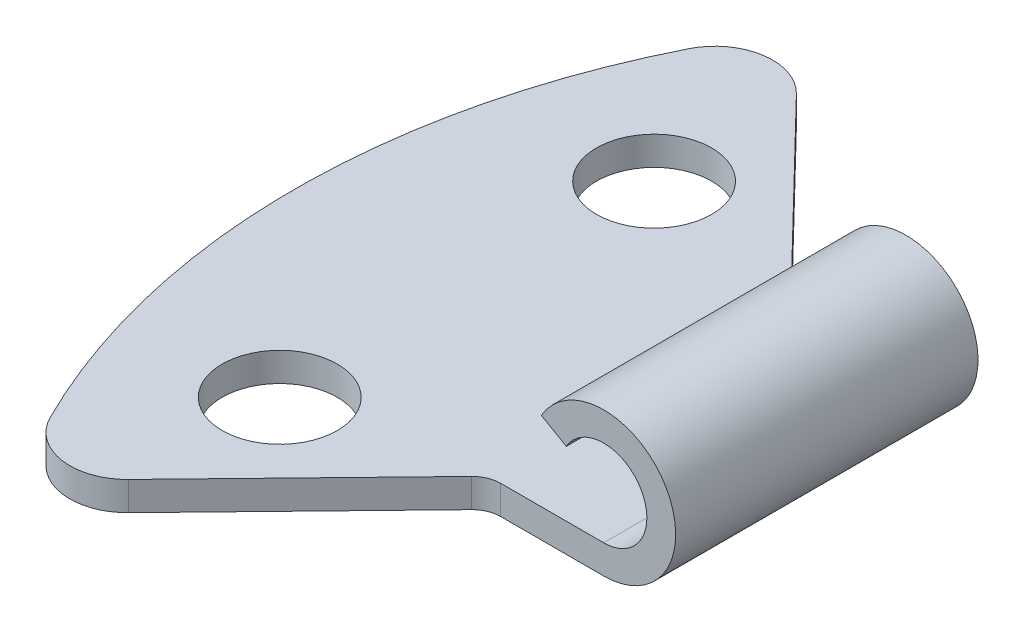
ISO-10303-21;
HEADER;
FILE_DESCRIPTION(('STEP AP214'),'2;1');
FILE_NAME('part.step','',(''),(''),'','','');
FILE_SCHEMA(('AUTOMOTIVE_DESIGN { 1 0 10303 214 1 1 1 1 }'));
ENDSEC;
DATA;
#1=APPLICATION_CONTEXT('core data for automotive mechanical design processes');
#2=APPLICATION_PROTOCOL_DEFINITION('international standard','automotive_design',2000,#1);
#3=PRODUCT_CONTEXT('',#1,'mechanical');
#4=PRODUCT('Part','Part','',(#3));
#5=PRODUCT_RELATED_PRODUCT_CATEGORY('part','',(#4));
#6=PRODUCT_DEFINITION_FORMATION('','',#4);
#7=PRODUCT_DEFINITION_CONTEXT('part definition',#1,'design');
#8=PRODUCT_DEFINITION('design','',#6,#7);
#9=PRODUCT_DEFINITION_SHAPE('','',#8);
#10=(LENGTH_UNIT() NAMED_UNIT(*) SI_UNIT(.MILLI.,.METRE.));
#11=(NAMED_UNIT(*) PLANE_ANGLE_UNIT() SI_UNIT($,.RADIAN.));
#12=(NAMED_UNIT(*) SI_UNIT($,.STERADIAN.) SOLID_ANGLE_UNIT());
#13=UNCERTAINTY_MEASURE_WITH_UNIT(LENGTH_MEASURE(1.E-05),#10,'distance_accuracy_value','');
#14=(GEOMETRIC_REPRESENTATION_CONTEXT(3) GLOBAL_UNCERTAINTY_ASSIGNED_CONTEXT((#13)) GLOBAL_UNIT_ASSIGNED_CONTEXT((#10,
#11,#12)) REPRESENTATION_CONTEXT('',''));
#15=CARTESIAN_POINT('',(0.,0.,0.));
#16=DIRECTION('',(0.,0.,1.));
#17=DIRECTION('',(1.,0.,0.));
#18=AXIS2_PLACEMENT_3D('',#15,#16,#17);
#19=CARTESIAN_POINT('',(8.,2.5,27.));
#20=DIRECTION('',(0.,0.,-1.));
#21=DIRECTION('',(-1.,0.,0.));
#22=AXIS2_PLACEMENT_3D('',#19,#20,#21);
#23=CYLINDRICAL_SURFACE('',#22,2.5);
#24=CARTESIAN_POINT('',(8.,2.5,8.25));
#25=DIRECTION('',(0.,0.,-1.));
#26=DIRECTION('',(-1.,0.,0.));
#27=AXIS2_PLACEMENT_3D('',#24,#25,#26);
#28=CIRCLE('',#27,2.5);
#29=CARTESIAN_POINT('',(5.83493649053891,3.75000000000001,8.25));
#30=VERTEX_POINT('',#29);
#31=CARTESIAN_POINT('',(8.,0.,8.25));
#32=VERTEX_POINT('',#31);
#33=EDGE_CURVE('E269',#30,#32,#28,.T.);
#34=ORIENTED_EDGE('',*,*,#33,.F.);
#35=DIRECTION('',(0.,0.,-1.));
#36=VECTOR('',#35,1.);
#37=CARTESIAN_POINT('',(5.83493649053891,3.75000000000001,27.));
#38=LINE('',#37,#36);
#39=CARTESIAN_POINT('',(5.83493649053891,3.75000000000001,18.75));
#40=VERTEX_POINT('',#39);
#41=EDGE_CURVE('E311',#40,#30,#38,.T.);
#42=ORIENTED_EDGE('',*,*,#41,.F.);
#43=CARTESIAN_POINT('',(8.,2.5,18.75));
#44=DIRECTION('',(0.,0.,1.));
#45=DIRECTION('',(1.,0.,0.));
#46=AXIS2_PLACEMENT_3D('',#43,#44,#45);
#47=CIRCLE('',#46,2.5);
#48=CARTESIAN_POINT('',(8.,0.,18.75));
#49=VERTEX_POINT('',#48);
#50=EDGE_CURVE('E294',#49,#40,#47,.T.);
#51=ORIENTED_EDGE('',*,*,#50,.F.);
#52=DIRECTION('',(0.,0.,-1.));
#53=VECTOR('',#52,1.);
#54=CARTESIAN_POINT('',(8.,0.,27.));
#55=LINE('',#54,#53);
#56=EDGE_CURVE('E314',#49,#32,#55,.T.);
#57=ORIENTED_EDGE('',*,*,#56,.T.);
#58=EDGE_LOOP('',(#34,#42,#51,#57));
#59=FACE_BOUND('',#58,.T.);
#60=ADVANCED_FACE('F146',(#59),#23,.T.);
#61=CARTESIAN_POINT('',(5.83493649053891,3.75000000000001,27.));
#62=DIRECTION('',(0.500000000000003,0.866025403784437,0.));
#63=DIRECTION('',(-0.866025403784437,0.500000000000003,0.));
#64=AXIS2_PLACEMENT_3D('',#61,#62,#63);
#65=PLANE('',#64);
#66=DIRECTION('',(-0.866025403784437,0.500000000000003,0.));
#67=VECTOR('',#66,1.);
#68=CARTESIAN_POINT('',(5.83493649053891,3.75000000000001,8.25));
#69=LINE('',#68,#67);
#70=CARTESIAN_POINT('',(6.70096189432335,3.25000000000001,8.25));
#71=VERTEX_POINT('',#70);
#72=EDGE_CURVE('E267',#71,#30,#69,.T.);
#73=ORIENTED_EDGE('',*,*,#72,.F.);
#74=DIRECTION('',(0.,0.,-1.));
#75=VECTOR('',#74,1.);
#76=CARTESIAN_POINT('',(6.70096189432335,3.25000000000001,27.));
#77=LINE('',#76,#75);
#78=CARTESIAN_POINT('',(6.70096189432335,3.25000000000001,18.75));
#79=VERTEX_POINT('',#78);
#80=EDGE_CURVE('E308',#79,#71,#77,.T.);
#81=ORIENTED_EDGE('',*,*,#80,.F.);
#82=DIRECTION('',(0.866025403784437,-0.500000000000003,0.));
#83=VECTOR('',#82,1.);
#84=CARTESIAN_POINT('',(5.83493649053891,3.75000000000001,18.75));
#85=LINE('',#84,#83);
#86=EDGE_CURVE('E292',#40,#79,#85,.T.);
#87=ORIENTED_EDGE('',*,*,#86,.F.);
#88=ORIENTED_EDGE('',*,*,#41,.T.);
#89=EDGE_LOOP('',(#73,#81,#87,#88));
#90=FACE_BOUND('',#89,.T.);
#91=ADVANCED_FACE('F348',(#90),#65,.F.);
#92=CARTESIAN_POINT('',(8.,2.5,27.));
#93=DIRECTION('',(0.,0.,-1.));
#94=DIRECTION('',(-1.,0.,0.));
#95=AXIS2_PLACEMENT_3D('',#92,#93,#94);
#96=CYLINDRICAL_SURFACE('',#95,1.5);
#97=CARTESIAN_POINT('',(8.,2.5,8.25));
#98=DIRECTION('',(0.,0.,-1.));
#99=DIRECTION('',(-1.,0.,0.));
#100=AXIS2_PLACEMENT_3D('',#97,#98,#99);
#101=CIRCLE('',#100,1.5);
#102=CARTESIAN_POINT('',(8.,1.,8.25));
#103=VERTEX_POINT('',#102);
#104=EDGE_CURVE('E247',#103,#71,#101,.F.);
#105=ORIENTED_EDGE('',*,*,#104,.F.);
#106=DIRECTION('',(0.,0.,-1.));
#107=VECTOR('',#106,1.);
#108=CARTESIAN_POINT('',(8.,1.,27.));
#109=LINE('',#108,#107);
#110=CARTESIAN_POINT('',(8.,1.,18.75));
#111=VERTEX_POINT('',#110);
#112=EDGE_CURVE('E305',#111,#103,#109,.T.);
#113=ORIENTED_EDGE('',*,*,#112,.F.);
#114=CARTESIAN_POINT('',(8.,2.5,18.75));
#115=DIRECTION('',(0.,0.,1.));
#116=DIRECTION('',(1.,0.,0.));
#117=AXIS2_PLACEMENT_3D('',#114,#115,#116);
#118=CIRCLE('',#117,1.5);
#119=EDGE_CURVE('E161',#79,#111,#118,.F.);
#120=ORIENTED_EDGE('',*,*,#119,.F.);
#121=ORIENTED_EDGE('',*,*,#80,.T.);
#122=EDGE_LOOP('',(#105,#113,#120,#121));
#123=FACE_BOUND('',#122,.T.);
#124=ADVANCED_FACE('F343',(#123),#96,.F.);
#125=CARTESIAN_POINT('',(-8.,0.,27.));
#126=DIRECTION('',(0.,1.,0.));
#127=DIRECTION('',(0.,0.,1.));
#128=AXIS2_PLACEMENT_3D('',#125,#126,#127);
#129=PLANE('',#128);
#130=CARTESIAN_POINT('',(-2.,0.,20.));
#131=DIRECTION('',(0.,1.,0.));
#132=DIRECTION('',(0.,0.,1.));
#133=AXIS2_PLACEMENT_3D('',#130,#131,#132);
#134=CIRCLE('',#133,2.);
#135=CARTESIAN_POINT('',(-2.,0.,22.));
#136=VERTEX_POINT('',#135);
#137=EDGE_CURVE('E284',#136,#136,#134,.F.);
#138=ORIENTED_EDGE('',*,*,#137,.F.);
#139=EDGE_LOOP('',(#138));
#140=FACE_BOUND('',#139,.T.);
#141=CARTESIAN_POINT('',(-2.,0.,7.));
#142=DIRECTION('',(0.,1.,0.));
#143=DIRECTION('',(0.,0.,1.));
#144=AXIS2_PLACEMENT_3D('',#141,#142,#143);
#145=CIRCLE('',#144,2.);
#146=CARTESIAN_POINT('',(-2.,0.,9.));
#147=VERTEX_POINT('',#146);
#148=EDGE_CURVE('E288',#147,#147,#145,.F.);
#149=ORIENTED_EDGE('',*,*,#148,.F.);
#150=EDGE_LOOP('',(#149));
#151=FACE_BOUND('',#150,.T.);
#152=DIRECTION('',(-1.,0.,0.));
#153=VECTOR('',#152,1.);
#154=CARTESIAN_POINT('',(-8.,0.,8.24999999999999));
#155=LINE('',#154,#153);
#156=CARTESIAN_POINT('',(4.42325393146197,0.,8.25));
#157=VERTEX_POINT('',#156);
#158=EDGE_CURVE('E271',#32,#157,#155,.T.);
#159=ORIENTED_EDGE('',*,*,#158,.F.);
#160=ORIENTED_EDGE('',*,*,#56,.F.);
#161=DIRECTION('',(1.,0.,0.));
#162=VECTOR('',#161,1.);
#163=CARTESIAN_POINT('',(-8.,0.,18.75));
#164=LINE('',#163,#162);
#165=CARTESIAN_POINT('',(4.42325393146197,0.,18.75));
#166=VERTEX_POINT('',#165);
#167=EDGE_CURVE('E296',#166,#49,#164,.T.);
#168=ORIENTED_EDGE('',*,*,#167,.F.);
#169=CARTESIAN_POINT('',(4.42325393146197,0.,19.75));
#170=DIRECTION('',(0.,1.,0.));
#171=DIRECTION('',(0.,0.,1.));
#172=AXIS2_PLACEMENT_3D('',#169,#170,#171);
#173=CIRCLE('',#172,1.);
#174=CARTESIAN_POINT('',(3.70535353801091,0.,19.0538541639262));
#175=VERTEX_POINT('',#174);
#176=EDGE_CURVE('E303',#175,#166,#173,.F.);
#177=ORIENTED_EDGE('',*,*,#176,.F.);
#178=DIRECTION('',(0.69614583607375,0.,-0.717900393451055));
#179=VECTOR('',#178,1.);
#180=CARTESIAN_POINT('',(-5.93847610033129,0.,28.9990534784666));
#181=LINE('',#180,#179);
#182=CARTESIAN_POINT('',(-2.15211602288414,0.,25.0943696485993));
#183=VERTEX_POINT('',#182);
#184=EDGE_CURVE('E169',#183,#175,#181,.T.);
#185=ORIENTED_EDGE('',*,*,#184,.F.);
#186=CARTESIAN_POINT('',(-3.58791680978625,0.,23.7020779764518));
#187=DIRECTION('',(0.,1.,0.));
#188=DIRECTION('',(0.,0.,1.));
#189=AXIS2_PLACEMENT_3D('',#186,#187,#188);
#190=CIRCLE('',#189,2.);
#191=CARTESIAN_POINT('',(-5.37615641997325,0.,24.5977336561403));
#192=VERTEX_POINT('',#191);
#193=EDGE_CURVE('E300',#192,#183,#190,.T.);
#194=ORIENTED_EDGE('',*,*,#193,.F.);
#195=CARTESIAN_POINT('',(16.78125,0.,13.5));
#196=DIRECTION('',(0.,1.,0.));
#197=DIRECTION('',(0.,0.,1.));
#198=AXIS2_PLACEMENT_3D('',#195,#196,#197);
#199=CIRCLE('',#198,24.78125);
#200=CARTESIAN_POINT('',(-5.37615641997325,0.,2.40226634385975));
#201=VERTEX_POINT('',#200);
#202=EDGE_CURVE('E298',#201,#192,#199,.T.);
#203=ORIENTED_EDGE('',*,*,#202,.F.);
#204=CARTESIAN_POINT('',(-3.58791680978625,0.,3.29792202354823));
#205=DIRECTION('',(0.,1.,0.));
#206=DIRECTION('',(0.,0.,1.));
#207=AXIS2_PLACEMENT_3D('',#204,#205,#206);
#208=CIRCLE('',#207,2.);
#209=CARTESIAN_POINT('',(-2.15211602288414,0.,1.90563035140073));
#210=VERTEX_POINT('',#209);
#211=EDGE_CURVE('E248',#210,#201,#208,.T.);
#212=ORIENTED_EDGE('',*,*,#211,.F.);
#213=DIRECTION('',(-0.696145836073751,0.,-0.717900393451055));
#214=VECTOR('',#213,1.);
#215=CARTESIAN_POINT('',(7.5551348793185,0.,11.9162328442972));
#216=LINE('',#215,#214);
#217=CARTESIAN_POINT('',(3.70535353801091,0.,7.94614583607375));
#218=VERTEX_POINT('',#217);
#219=EDGE_CURVE('E253',#218,#210,#216,.T.);
#220=ORIENTED_EDGE('',*,*,#219,.F.);
#221=CARTESIAN_POINT('',(4.42325393146197,0.,7.25));
#222=DIRECTION('',(0.,1.,0.));
#223=DIRECTION('',(0.,0.,1.));
#224=AXIS2_PLACEMENT_3D('',#221,#222,#223);
#225=CIRCLE('',#224,1.);
#226=EDGE_CURVE('E237',#157,#218,#225,.F.);
#227=ORIENTED_EDGE('',*,*,#226,.F.);
#228=EDGE_LOOP('',(#159,#160,#168,#177,#185,#194,#203,#212,#220,#227));
#229=FACE_BOUND('',#228,.T.);
#230=ADVANCED_FACE('F148',(#140,#151,#229),#129,.F.);
#231=CARTESIAN_POINT('',(-8.,1.,27.));
#232=DIRECTION('',(0.,-1.,0.));
#233=DIRECTION('',(1.,0.,0.));
#234=AXIS2_PLACEMENT_3D('',#231,#232,#233);
#235=PLANE('',#234);
#236=CARTESIAN_POINT('',(-2.,1.,20.));
#237=DIRECTION('',(0.,-1.,0.));
#238=DIRECTION('',(1.,0.,0.));
#239=AXIS2_PLACEMENT_3D('',#236,#237,#238);
#240=CIRCLE('',#239,2.);
#241=CARTESIAN_POINT('',(0.,1.,20.));
#242=VERTEX_POINT('',#241);
#243=EDGE_CURVE('E283',#242,#242,#240,.F.);
#244=ORIENTED_EDGE('',*,*,#243,.F.);
#245=EDGE_LOOP('',(#244));
#246=FACE_BOUND('',#245,.T.);
#247=CARTESIAN_POINT('',(-2.,1.,7.));
#248=DIRECTION('',(0.,-1.,0.));
#249=DIRECTION('',(1.,0.,0.));
#250=AXIS2_PLACEMENT_3D('',#247,#248,#249);
#251=CIRCLE('',#250,2.);
#252=CARTESIAN_POINT('',(0.,1.,7.));
#253=VERTEX_POINT('',#252);
#254=EDGE_CURVE('E287',#253,#253,#251,.F.);
#255=ORIENTED_EDGE('',*,*,#254,.F.);
#256=EDGE_LOOP('',(#255));
#257=FACE_BOUND('',#256,.T.);
#258=DIRECTION('',(1.,0.,0.));
#259=VECTOR('',#258,1.);
#260=CARTESIAN_POINT('',(-8.,1.,8.24999999999999));
#261=LINE('',#260,#259);
#262=CARTESIAN_POINT('',(4.42325393146197,1.,8.25));
#263=VERTEX_POINT('',#262);
#264=EDGE_CURVE('E12',#263,#103,#261,.T.);
#265=ORIENTED_EDGE('',*,*,#264,.F.);
#266=CARTESIAN_POINT('',(4.42325393146197,1.,7.25));
#267=DIRECTION('',(0.,-1.,0.));
#268=DIRECTION('',(1.,0.,0.));
#269=AXIS2_PLACEMENT_3D('',#266,#267,#268);
#270=CIRCLE('',#269,1.);
#271=CARTESIAN_POINT('',(3.70535353801091,1.,7.94614583607375));
#272=VERTEX_POINT('',#271);
#273=EDGE_CURVE('E154',#272,#263,#270,.F.);
#274=ORIENTED_EDGE('',*,*,#273,.F.);
#275=DIRECTION('',(0.696145836073751,0.,0.717900393451055));
#276=VECTOR('',#275,1.);
#277=CARTESIAN_POINT('',(7.5551348793185,1.,11.9162328442972));
#278=LINE('',#277,#276);
#279=CARTESIAN_POINT('',(-2.15211602288414,1.,1.90563035140073));
#280=VERTEX_POINT('',#279);
#281=EDGE_CURVE('E256',#280,#272,#278,.T.);
#282=ORIENTED_EDGE('',*,*,#281,.F.);
#283=CARTESIAN_POINT('',(-3.58791680978625,1.,3.29792202354823));
#284=DIRECTION('',(0.,-1.,0.));
#285=DIRECTION('',(1.,0.,0.));
#286=AXIS2_PLACEMENT_3D('',#283,#284,#285);
#287=CIRCLE('',#286,2.);
#288=CARTESIAN_POINT('',(-5.37615641997325,1.,2.40226634385975));
#289=VERTEX_POINT('',#288);
#290=EDGE_CURVE('E332',#289,#280,#287,.T.);
#291=ORIENTED_EDGE('',*,*,#290,.F.);
#292=CARTESIAN_POINT('',(16.78125,1.,13.5));
#293=DIRECTION('',(0.,-1.,0.));
#294=DIRECTION('',(1.,0.,0.));
#295=AXIS2_PLACEMENT_3D('',#292,#293,#294);
#296=CIRCLE('',#295,24.78125);
#297=CARTESIAN_POINT('',(-5.37615641997325,1.00000000000001,24.5977336561403));
#298=VERTEX_POINT('',#297);
#299=EDGE_CURVE('E329',#298,#289,#296,.T.);
#300=ORIENTED_EDGE('',*,*,#299,.F.);
#301=CARTESIAN_POINT('',(-3.58791680978625,1.,23.7020779764518));
#302=DIRECTION('',(0.,-1.,0.));
#303=DIRECTION('',(1.,0.,0.));
#304=AXIS2_PLACEMENT_3D('',#301,#302,#303);
#305=CIRCLE('',#304,2.);
#306=CARTESIAN_POINT('',(-2.15211602288414,1.,25.0943696485993));
#307=VERTEX_POINT('',#306);
#308=EDGE_CURVE('E327',#307,#298,#305,.T.);
#309=ORIENTED_EDGE('',*,*,#308,.F.);
#310=DIRECTION('',(-0.69614583607375,0.,0.717900393451055));
#311=VECTOR('',#310,1.);
#312=CARTESIAN_POINT('',(-5.93847610033129,1.,28.9990534784666));
#313=LINE('',#312,#311);
#314=CARTESIAN_POINT('',(3.70535353801091,1.,19.0538541639262));
#315=VERTEX_POINT('',#314);
#316=EDGE_CURVE('E325',#315,#307,#313,.T.);
#317=ORIENTED_EDGE('',*,*,#316,.F.);
#318=CARTESIAN_POINT('',(4.42325393146197,1.,19.75));
#319=DIRECTION('',(0.,-1.,0.));
#320=DIRECTION('',(1.,0.,0.));
#321=AXIS2_PLACEMENT_3D('',#318,#319,#320);
#322=CIRCLE('',#321,1.);
#323=CARTESIAN_POINT('',(4.42325393146197,1.,18.75));
#324=VERTEX_POINT('',#323);
#325=EDGE_CURVE('E323',#324,#315,#322,.F.);
#326=ORIENTED_EDGE('',*,*,#325,.F.);
#327=DIRECTION('',(-1.,0.,0.));
#328=VECTOR('',#327,1.);
#329=CARTESIAN_POINT('',(-8.,1.,18.75));
#330=LINE('',#329,#328);
#331=EDGE_CURVE('E317',#111,#324,#330,.T.);
#332=ORIENTED_EDGE('',*,*,#331,.F.);
#333=ORIENTED_EDGE('',*,*,#112,.T.);
#334=EDGE_LOOP('',(#265,#274,#282,#291,#300,#309,#317,#326,#332,#333));
#335=FACE_BOUND('',#334,.T.);
#336=ADVANCED_FACE('F339',(#246,#257,#335),#235,.F.);
#337=CARTESIAN_POINT('',(-2.,28.,20.));
#338=DIRECTION('',(0.,-1.,0.));
#339=DIRECTION('',(1.,0.,0.));
#340=AXIS2_PLACEMENT_3D('',#337,#338,#339);
#341=CYLINDRICAL_SURFACE('',#340,2.);
#342=ORIENTED_EDGE('',*,*,#243,.T.);
#343=EDGE_LOOP('',(#342));
#344=FACE_BOUND('',#343,.T.);
#345=ORIENTED_EDGE('',*,*,#137,.T.);
#346=EDGE_LOOP('',(#345));
#347=FACE_BOUND('',#346,.T.);
#348=ADVANCED_FACE('F395',(#344,#347),#341,.F.);
#349=CARTESIAN_POINT('',(-2.,28.,7.));
#350=DIRECTION('',(0.,-1.,0.));
#351=DIRECTION('',(1.,0.,0.));
#352=AXIS2_PLACEMENT_3D('',#349,#350,#351);
#353=CYLINDRICAL_SURFACE('',#352,2.);
#354=ORIENTED_EDGE('',*,*,#254,.T.);
#355=EDGE_LOOP('',(#354));
#356=FACE_BOUND('',#355,.T.);
#357=ORIENTED_EDGE('',*,*,#148,.T.);
#358=EDGE_LOOP('',(#357));
#359=FACE_BOUND('',#358,.T.);
#360=ADVANCED_FACE('F398',(#356,#359),#353,.F.);
#361=CARTESIAN_POINT('',(4.42325393146196,28.,19.75));
#362=DIRECTION('',(0.,-1.,0.));
#363=DIRECTION('',(1.,0.,0.));
#364=AXIS2_PLACEMENT_3D('',#361,#362,#363);
#365=CYLINDRICAL_SURFACE('',#364,1.);
#366=ORIENTED_EDGE('',*,*,#176,.T.);
#367=DIRECTION('',(0.,-1.,0.));
#368=VECTOR('',#367,1.);
#369=CARTESIAN_POINT('',(4.42325393146196,28.,18.75));
#370=LINE('',#369,#368);
#371=EDGE_CURVE('E273',#324,#166,#370,.T.);
#372=ORIENTED_EDGE('',*,*,#371,.F.);
#373=ORIENTED_EDGE('',*,*,#325,.T.);
#374=DIRECTION('',(0.,-1.,0.));
#375=VECTOR('',#374,1.);
#376=CARTESIAN_POINT('',(3.70535353801091,28.,19.0538541639262));
#377=LINE('',#376,#375);
#378=EDGE_CURVE('E276',#315,#175,#377,.T.);
#379=ORIENTED_EDGE('',*,*,#378,.T.);
#380=EDGE_LOOP('',(#366,#372,#373,#379));
#381=FACE_BOUND('',#380,.T.);
#382=ADVANCED_FACE('F359',(#381),#365,.F.);
#383=CARTESIAN_POINT('',(11.4320870799811,28.,11.0856601987695));
#384=DIRECTION('',(0.717900393451055,0.,0.69614583607375));
#385=DIRECTION('',(0.69614583607375,0.,-0.717900393451055));
#386=AXIS2_PLACEMENT_3D('',#383,#384,#385);
#387=PLANE('',#386);
#388=ORIENTED_EDGE('',*,*,#184,.T.);
#389=ORIENTED_EDGE('',*,*,#378,.F.);
#390=ORIENTED_EDGE('',*,*,#316,.T.);
#391=DIRECTION('',(0.,-1.,0.));
#392=VECTOR('',#391,1.);
#393=CARTESIAN_POINT('',(-2.15211602288415,28.,25.0943696485993));
#394=LINE('',#393,#392);
#395=EDGE_CURVE('E278',#307,#183,#394,.T.);
#396=ORIENTED_EDGE('',*,*,#395,.T.);
#397=EDGE_LOOP('',(#388,#389,#390,#396));
#398=FACE_BOUND('',#397,.T.);
#399=ADVANCED_FACE('F364',(#398),#387,.T.);
#400=CARTESIAN_POINT('',(-3.58791680978625,28.,23.7020779764518));
#401=DIRECTION('',(0.,-1.,0.));
#402=DIRECTION('',(1.,0.,0.));
#403=AXIS2_PLACEMENT_3D('',#400,#401,#402);
#404=CYLINDRICAL_SURFACE('',#403,2.);
#405=ORIENTED_EDGE('',*,*,#193,.T.);
#406=ORIENTED_EDGE('',*,*,#395,.F.);
#407=ORIENTED_EDGE('',*,*,#308,.T.);
#408=DIRECTION('',(0.,-1.,0.));
#409=VECTOR('',#408,1.);
#410=CARTESIAN_POINT('',(-5.37615641997325,28.,24.5977336561403));
#411=LINE('',#410,#409);
#412=EDGE_CURVE('E280',#298,#192,#411,.T.);
#413=ORIENTED_EDGE('',*,*,#412,.T.);
#414=EDGE_LOOP('',(#405,#406,#407,#413));
#415=FACE_BOUND('',#414,.T.);
#416=ADVANCED_FACE('F366',(#415),#404,.T.);
#417=CARTESIAN_POINT('',(16.78125,28.,13.5));
#418=DIRECTION('',(0.,-1.,0.));
#419=DIRECTION('',(1.,0.,0.));
#420=AXIS2_PLACEMENT_3D('',#417,#418,#419);
#421=CYLINDRICAL_SURFACE('',#420,24.78125);
#422=ORIENTED_EDGE('',*,*,#202,.T.);
#423=ORIENTED_EDGE('',*,*,#412,.F.);
#424=ORIENTED_EDGE('',*,*,#299,.T.);
#425=DIRECTION('',(0.,1.,0.));
#426=VECTOR('',#425,1.);
#427=CARTESIAN_POINT('',(-5.37615641997324,-26.,2.40226634385975));
#428=LINE('',#427,#426);
#429=EDGE_CURVE('E338',#201,#289,#428,.T.);
#430=ORIENTED_EDGE('',*,*,#429,.F.);
#431=EDGE_LOOP('',(#422,#423,#424,#430));
#432=FACE_BOUND('',#431,.T.);
#433=ADVANCED_FACE('F375',(#432),#421,.T.);
#434=CARTESIAN_POINT('',(0.,28.,18.75));
#435=DIRECTION('',(0.,0.,1.));
#436=DIRECTION('',(1.,0.,0.));
#437=AXIS2_PLACEMENT_3D('',#434,#435,#436);
#438=PLANE('',#437);
#439=ORIENTED_EDGE('',*,*,#167,.T.);
#440=ORIENTED_EDGE('',*,*,#50,.T.);
#441=ORIENTED_EDGE('',*,*,#86,.T.);
#442=ORIENTED_EDGE('',*,*,#119,.T.);
#443=ORIENTED_EDGE('',*,*,#331,.T.);
#444=ORIENTED_EDGE('',*,*,#371,.T.);
#445=EDGE_LOOP('',(#439,#440,#441,#442,#443,#444));
#446=FACE_BOUND('',#445,.T.);
#447=ADVANCED_FACE('F356',(#446),#438,.T.);
#448=CARTESIAN_POINT('',(0.,-26.,8.24999999999999));
#449=DIRECTION('',(0.,0.,-1.));
#450=DIRECTION('',(-1.,0.,0.));
#451=AXIS2_PLACEMENT_3D('',#448,#449,#450);
#452=PLANE('',#451);
#453=ORIENTED_EDGE('',*,*,#158,.T.);
#454=DIRECTION('',(0.,1.,0.));
#455=VECTOR('',#454,1.);
#456=CARTESIAN_POINT('',(4.42325393146197,-26.,8.25));
#457=LINE('',#456,#455);
#458=EDGE_CURVE('E243',#157,#263,#457,.T.);
#459=ORIENTED_EDGE('',*,*,#458,.T.);
#460=ORIENTED_EDGE('',*,*,#264,.T.);
#461=ORIENTED_EDGE('',*,*,#104,.T.);
#462=ORIENTED_EDGE('',*,*,#72,.T.);
#463=ORIENTED_EDGE('',*,*,#33,.T.);
#464=EDGE_LOOP('',(#453,#459,#460,#461,#462,#463));
#465=FACE_BOUND('',#464,.T.);
#466=ADVANCED_FACE('F336',(#465),#452,.T.);
#467=CARTESIAN_POINT('',(4.42325393146197,-26.,7.25));
#468=DIRECTION('',(0.,1.,0.));
#469=DIRECTION('',(-1.,0.,0.));
#470=AXIS2_PLACEMENT_3D('',#467,#468,#469);
#471=CYLINDRICAL_SURFACE('',#470,1.);
#472=ORIENTED_EDGE('',*,*,#226,.T.);
#473=DIRECTION('',(0.,1.,0.));
#474=VECTOR('',#473,1.);
#475=CARTESIAN_POINT('',(3.70535353801091,-26.,7.94614583607375));
#476=LINE('',#475,#474);
#477=EDGE_CURVE('E240',#218,#272,#476,.T.);
#478=ORIENTED_EDGE('',*,*,#477,.T.);
#479=ORIENTED_EDGE('',*,*,#273,.T.);
#480=ORIENTED_EDGE('',*,*,#458,.F.);
#481=EDGE_LOOP('',(#472,#478,#479,#480));
#482=FACE_BOUND('',#481,.T.);
#483=ADVANCED_FACE('F239',(#482),#471,.F.);
#484=CARTESIAN_POINT('',(-3.58791680978624,-26.,3.29792202354823));
#485=DIRECTION('',(0.,1.,0.));
#486=DIRECTION('',(-1.,0.,0.));
#487=AXIS2_PLACEMENT_3D('',#484,#485,#486);
#488=CYLINDRICAL_SURFACE('',#487,2.);
#489=ORIENTED_EDGE('',*,*,#211,.T.);
#490=ORIENTED_EDGE('',*,*,#429,.T.);
#491=ORIENTED_EDGE('',*,*,#290,.T.);
#492=DIRECTION('',(0.,1.,0.));
#493=VECTOR('',#492,1.);
#494=CARTESIAN_POINT('',(-2.15211602288414,-26.,1.90563035140073));
#495=LINE('',#494,#493);
#496=EDGE_CURVE('E257',#210,#280,#495,.T.);
#497=ORIENTED_EDGE('',*,*,#496,.F.);
#498=EDGE_LOOP('',(#489,#490,#491,#497));
#499=FACE_BOUND('',#498,.T.);
#500=ADVANCED_FACE('F373',(#499),#488,.T.);
#501=CARTESIAN_POINT('',(-2.06152389966871,-26.,1.99905347846664));
#502=DIRECTION('',(0.717900393451054,0.,-0.69614583607375));
#503=DIRECTION('',(-0.696145836073751,0.,-0.717900393451055));
#504=AXIS2_PLACEMENT_3D('',#501,#502,#503);
#505=PLANE('',#504);
#506=ORIENTED_EDGE('',*,*,#219,.T.);
#507=ORIENTED_EDGE('',*,*,#496,.T.);
#508=ORIENTED_EDGE('',*,*,#281,.T.);
#509=ORIENTED_EDGE('',*,*,#477,.F.);
#510=EDGE_LOOP('',(#506,#507,#508,#509));
#511=FACE_BOUND('',#510,.T.);
#512=ADVANCED_FACE('F251',(#511),#505,.T.);
#513=CLOSED_SHELL('',(#60,#91,#124,#230,#336,#348,#360,#382,#399,#416,#433,#447,#466,#483,#500,#512));
#514=MANIFOLD_SOLID_BREP('B2',#513);
#515=ADVANCED_BREP_SHAPE_REPRESENTATION('',(#18,#514),#14);
#516=SHAPE_DEFINITION_REPRESENTATION(#9,#515);
ENDSEC;
END-ISO-10303-21;
